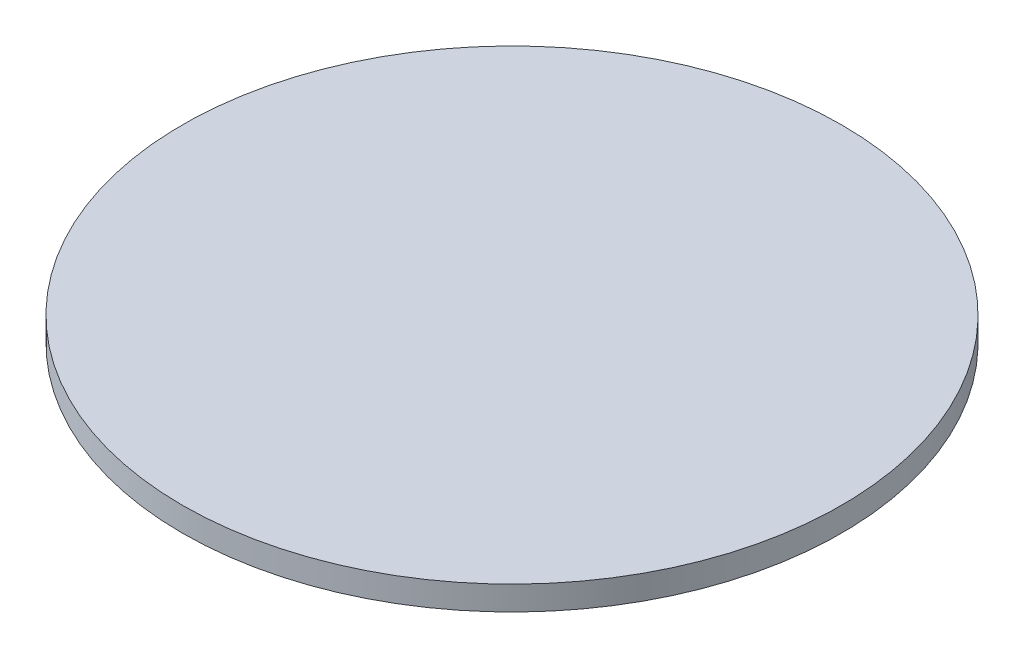
ISO-10303-21;
HEADER;
FILE_DESCRIPTION(('STEP AP214'),'2;1');
FILE_NAME('part.step','',(''),(''),'','','');
FILE_SCHEMA(('AUTOMOTIVE_DESIGN { 1 0 10303 214 1 1 1 1 }'));
ENDSEC;
DATA;
#1=APPLICATION_CONTEXT('core data for automotive mechanical design processes');
#2=APPLICATION_PROTOCOL_DEFINITION('international standard','automotive_design',2000,#1);
#3=PRODUCT_CONTEXT('',#1,'mechanical');
#4=PRODUCT('Part','Part','',(#3));
#5=PRODUCT_RELATED_PRODUCT_CATEGORY('part','',(#4));
#6=PRODUCT_DEFINITION_FORMATION('','',#4);
#7=PRODUCT_DEFINITION_CONTEXT('part definition',#1,'design');
#8=PRODUCT_DEFINITION('design','',#6,#7);
#9=PRODUCT_DEFINITION_SHAPE('','',#8);
#10=(LENGTH_UNIT() NAMED_UNIT(*) SI_UNIT(.MILLI.,.METRE.));
#11=(NAMED_UNIT(*) PLANE_ANGLE_UNIT() SI_UNIT($,.RADIAN.));
#12=(NAMED_UNIT(*) SI_UNIT($,.STERADIAN.) SOLID_ANGLE_UNIT());
#13=UNCERTAINTY_MEASURE_WITH_UNIT(LENGTH_MEASURE(1.E-05),#10,'distance_accuracy_value','');
#14=(GEOMETRIC_REPRESENTATION_CONTEXT(3) GLOBAL_UNCERTAINTY_ASSIGNED_CONTEXT((#13)) GLOBAL_UNIT_ASSIGNED_CONTEXT((#10,
#11,#12)) REPRESENTATION_CONTEXT('',''));
#15=CARTESIAN_POINT('',(0.,0.,0.));
#16=DIRECTION('',(0.,0.,1.));
#17=DIRECTION('',(1.,0.,0.));
#18=AXIS2_PLACEMENT_3D('',#15,#16,#17);
#19=CARTESIAN_POINT('',(0.,1.1,0.));
#20=DIRECTION('',(0.,-1.,0.));
#21=DIRECTION('',(0.,0.,-1.));
#22=AXIS2_PLACEMENT_3D('',#19,#20,#21);
#23=CYLINDRICAL_SURFACE('',#22,15.);
#24=CARTESIAN_POINT('',(0.,1.1,0.));
#25=DIRECTION('',(0.,1.,0.));
#26=DIRECTION('',(0.,0.,1.));
#27=AXIS2_PLACEMENT_3D('',#24,#25,#26);
#28=CIRCLE('',#27,15.);
#29=CARTESIAN_POINT('',(0.,1.1,15.));
#30=VERTEX_POINT('',#29);
#31=EDGE_CURVE('E10',#30,#30,#28,.T.);
#32=ORIENTED_EDGE('',*,*,#31,.F.);
#33=EDGE_LOOP('',(#32));
#34=FACE_BOUND('',#33,.T.);
#35=CARTESIAN_POINT('',(0.,0.,0.));
#36=DIRECTION('',(0.,1.,0.));
#37=DIRECTION('',(0.,0.,1.));
#38=AXIS2_PLACEMENT_3D('',#35,#36,#37);
#39=CIRCLE('',#38,15.);
#40=CARTESIAN_POINT('',(0.,0.,15.));
#41=VERTEX_POINT('',#40);
#42=EDGE_CURVE('E34',#41,#41,#39,.T.);
#43=ORIENTED_EDGE('',*,*,#42,.T.);
#44=EDGE_LOOP('',(#43));
#45=FACE_BOUND('',#44,.T.);
#46=ADVANCED_FACE('F31',(#34,#45),#23,.T.);
#47=CARTESIAN_POINT('',(0.,1.1,0.));
#48=DIRECTION('',(0.,1.,0.));
#49=DIRECTION('',(0.,0.,1.));
#50=AXIS2_PLACEMENT_3D('',#47,#48,#49);
#51=PLANE('',#50);
#52=ORIENTED_EDGE('',*,*,#31,.T.);
#53=EDGE_LOOP('',(#52));
#54=FACE_BOUND('',#53,.T.);
#55=ADVANCED_FACE('F46',(#54),#51,.T.);
#56=CARTESIAN_POINT('',(0.,0.,0.));
#57=DIRECTION('',(0.,1.,0.));
#58=DIRECTION('',(0.,0.,1.));
#59=AXIS2_PLACEMENT_3D('',#56,#57,#58);
#60=PLANE('',#59);
#61=ORIENTED_EDGE('',*,*,#42,.F.);
#62=EDGE_LOOP('',(#61));
#63=FACE_BOUND('',#62,.T.);
#64=ADVANCED_FACE('F44',(#63),#60,.F.);
#65=CLOSED_SHELL('',(#46,#55,#64));
#66=MANIFOLD_SOLID_BREP('B2',#65);
#67=ADVANCED_BREP_SHAPE_REPRESENTATION('',(#18,#66),#14);
#68=SHAPE_DEFINITION_REPRESENTATION(#9,#67);
ENDSEC;
END-ISO-10303-21;
